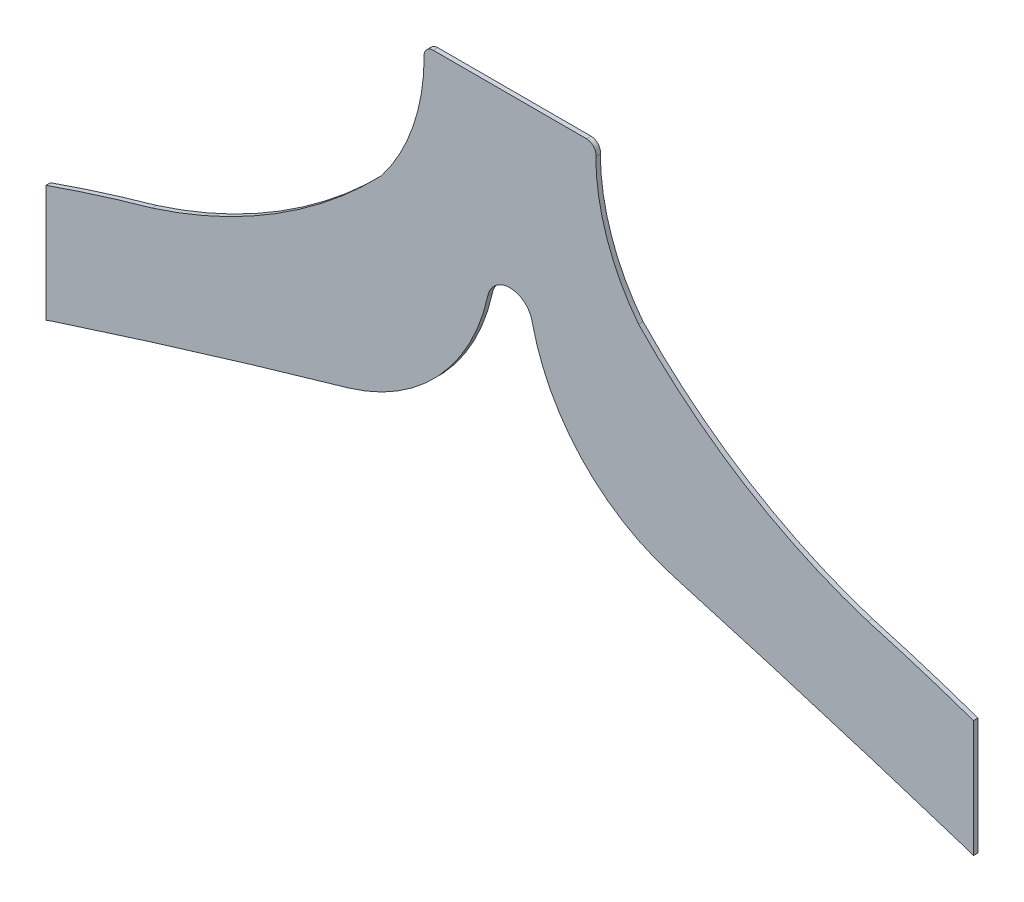
ISO-10303-21;
HEADER;
FILE_DESCRIPTION(('STEP AP214'),'2;1');
FILE_NAME('part.step','',(''),(''),'','','');
FILE_SCHEMA(('AUTOMOTIVE_DESIGN { 1 0 10303 214 1 1 1 1 }'));
ENDSEC;
DATA;
#1=APPLICATION_CONTEXT('core data for automotive mechanical design processes');
#2=APPLICATION_PROTOCOL_DEFINITION('international standard','automotive_design',2000,#1);
#3=PRODUCT_CONTEXT('',#1,'mechanical');
#4=PRODUCT('Part','Part','',(#3));
#5=PRODUCT_RELATED_PRODUCT_CATEGORY('part','',(#4));
#6=PRODUCT_DEFINITION_FORMATION('','',#4);
#7=PRODUCT_DEFINITION_CONTEXT('part definition',#1,'design');
#8=PRODUCT_DEFINITION('design','',#6,#7);
#9=PRODUCT_DEFINITION_SHAPE('','',#8);
#10=(LENGTH_UNIT() NAMED_UNIT(*) SI_UNIT(.MILLI.,.METRE.));
#11=(NAMED_UNIT(*) PLANE_ANGLE_UNIT() SI_UNIT($,.RADIAN.));
#12=(NAMED_UNIT(*) SI_UNIT($,.STERADIAN.) SOLID_ANGLE_UNIT());
#13=UNCERTAINTY_MEASURE_WITH_UNIT(LENGTH_MEASURE(1.E-05),#10,'distance_accuracy_value','');
#14=(GEOMETRIC_REPRESENTATION_CONTEXT(3) GLOBAL_UNCERTAINTY_ASSIGNED_CONTEXT((#13)) GLOBAL_UNIT_ASSIGNED_CONTEXT((#10,
#11,#12)) REPRESENTATION_CONTEXT('',''));
#15=CARTESIAN_POINT('',(0.,0.,0.));
#16=DIRECTION('',(0.,0.,1.));
#17=DIRECTION('',(1.,0.,0.));
#18=AXIS2_PLACEMENT_3D('',#15,#16,#17);
#19=CARTESIAN_POINT('',(-650.809500657787,926.892746035444,0.));
#20=DIRECTION('',(-1.,0.,0.));
#21=DIRECTION('',(0.,-1.,0.));
#22=AXIS2_PLACEMENT_3D('',#19,#20,#21);
#23=PLANE('',#22);
#24=DIRECTION('',(0.,0.,-1.));
#25=VECTOR('',#24,1.);
#26=CARTESIAN_POINT('',(-650.809500657786,687.87310873165,6.35));
#27=LINE('',#26,#25);
#28=CARTESIAN_POINT('',(-650.809500657786,687.87310873165,6.35));
#29=VERTEX_POINT('',#28);
#30=CARTESIAN_POINT('',(-650.809500657786,687.87310873165,0.));
#31=VERTEX_POINT('',#30);
#32=EDGE_CURVE('E44',#29,#31,#27,.T.);
#33=ORIENTED_EDGE('',*,*,#32,.F.);
#34=DIRECTION('',(0.,-1.,0.));
#35=VECTOR('',#34,1.);
#36=CARTESIAN_POINT('',(-650.809500657786,-2255.82427941432,6.35));
#37=LINE('',#36,#35);
#38=CARTESIAN_POINT('',(-650.809500657787,851.947732984082,6.35));
#39=VERTEX_POINT('',#38);
#40=EDGE_CURVE('E305',#39,#29,#37,.T.);
#41=ORIENTED_EDGE('',*,*,#40,.F.);
#42=DIRECTION('',(0.,0.,-1.));
#43=VECTOR('',#42,1.);
#44=CARTESIAN_POINT('',(-650.809500657787,851.947732984082,6.35));
#45=LINE('',#44,#43);
#46=CARTESIAN_POINT('',(-650.809500657787,851.947732984082,0.));
#47=VERTEX_POINT('',#46);
#48=EDGE_CURVE('E302',#39,#47,#45,.T.);
#49=ORIENTED_EDGE('',*,*,#48,.T.);
#50=DIRECTION('',(0.,-1.,0.));
#51=VECTOR('',#50,1.);
#52=CARTESIAN_POINT('',(-650.809500657786,-2255.82427941432,0.));
#53=LINE('',#52,#51);
#54=EDGE_CURVE('E49',#47,#31,#53,.T.);
#55=ORIENTED_EDGE('',*,*,#54,.T.);
#56=EDGE_LOOP('',(#33,#41,#49,#55));
#57=FACE_BOUND('',#56,.T.);
#58=ADVANCED_FACE('F40',(#57),#23,.T.);
#59=CARTESIAN_POINT('',(650.809500657787,926.892746035444,0.));
#60=DIRECTION('',(1.,0.,0.));
#61=DIRECTION('',(0.,-1.,0.));
#62=AXIS2_PLACEMENT_3D('',#59,#60,#61);
#63=PLANE('',#62);
#64=DIRECTION('',(0.,0.,-1.));
#65=VECTOR('',#64,1.);
#66=CARTESIAN_POINT('',(650.809500657786,688.128874906157,6.35));
#67=LINE('',#66,#65);
#68=CARTESIAN_POINT('',(650.809500657786,688.128874906157,0.));
#69=VERTEX_POINT('',#68);
#70=CARTESIAN_POINT('',(650.809500657786,688.128874906157,6.35));
#71=VERTEX_POINT('',#70);
#72=EDGE_CURVE('E308',#69,#71,#67,.F.);
#73=ORIENTED_EDGE('',*,*,#72,.F.);
#74=DIRECTION('',(0.,1.,0.));
#75=VECTOR('',#74,1.);
#76=CARTESIAN_POINT('',(650.809500657786,-2255.82427941432,0.));
#77=LINE('',#76,#75);
#78=CARTESIAN_POINT('',(650.809500657787,852.172496678358,0.));
#79=VERTEX_POINT('',#78);
#80=EDGE_CURVE('E11',#69,#79,#77,.T.);
#81=ORIENTED_EDGE('',*,*,#80,.T.);
#82=DIRECTION('',(0.,0.,-1.));
#83=VECTOR('',#82,1.);
#84=CARTESIAN_POINT('',(650.809500657787,852.172496678358,6.35));
#85=LINE('',#84,#83);
#86=CARTESIAN_POINT('',(650.809500657787,852.172496678358,6.35));
#87=VERTEX_POINT('',#86);
#88=EDGE_CURVE('E309',#79,#87,#85,.F.);
#89=ORIENTED_EDGE('',*,*,#88,.T.);
#90=DIRECTION('',(0.,1.,0.));
#91=VECTOR('',#90,1.);
#92=CARTESIAN_POINT('',(650.809500657786,-2255.82427941432,6.35));
#93=LINE('',#92,#91);
#94=EDGE_CURVE('E180',#71,#87,#93,.T.);
#95=ORIENTED_EDGE('',*,*,#94,.F.);
#96=EDGE_LOOP('',(#73,#81,#89,#95));
#97=FACE_BOUND('',#96,.T.);
#98=ADVANCED_FACE('F42',(#97),#63,.T.);
#99=CARTESIAN_POINT('',(-498.992218517487,308.277459283282,6.35));
#100=DIRECTION('',(0.,0.,-1.));
#101=DIRECTION('',(-1.,0.,0.));
#102=AXIS2_PLACEMENT_3D('',#99,#100,#101);
#103=CYLINDRICAL_SURFACE('',#102,408.829236034553);
#104=CARTESIAN_POINT('',(-498.992218517487,308.277459283282,6.35));
#105=DIRECTION('',(0.,0.,1.));
#106=DIRECTION('',(1.,0.,0.));
#107=AXIS2_PLACEMENT_3D('',#104,#105,#106);
#108=CIRCLE('',#107,408.829236034553);
#109=CARTESIAN_POINT('',(-643.777799858192,690.610402766354,6.35));
#110=VERTEX_POINT('',#109);
#111=EDGE_CURVE('E216',#110,#29,#108,.T.);
#112=ORIENTED_EDGE('',*,*,#111,.T.);
#113=ORIENTED_EDGE('',*,*,#32,.T.);
#114=CARTESIAN_POINT('',(-498.992218517487,308.277459283282,0.));
#115=DIRECTION('',(0.,0.,1.));
#116=DIRECTION('',(1.,0.,0.));
#117=AXIS2_PLACEMENT_3D('',#114,#115,#116);
#118=CIRCLE('',#117,408.829236034553);
#119=CARTESIAN_POINT('',(-643.777799858192,690.610402766354,0.));
#120=VERTEX_POINT('',#119);
#121=EDGE_CURVE('E255',#120,#31,#118,.T.);
#122=ORIENTED_EDGE('',*,*,#121,.F.);
#123=DIRECTION('',(0.,0.,-1.));
#124=VECTOR('',#123,1.);
#125=CARTESIAN_POINT('',(-643.777799858192,690.610402766354,6.35));
#126=LINE('',#125,#124);
#127=EDGE_CURVE('E283',#110,#120,#126,.T.);
#128=ORIENTED_EDGE('',*,*,#127,.F.);
#129=EDGE_LOOP('',(#112,#113,#122,#128));
#130=FACE_BOUND('',#129,.T.);
#131=ADVANCED_FACE('F323',(#130),#103,.F.);
#132=CARTESIAN_POINT('',(3128.37589259121,-10927.1670204163,6.35));
#133=DIRECTION('',(0.,0.,-1.));
#134=DIRECTION('',(-1.,0.,0.));
#135=AXIS2_PLACEMENT_3D('',#132,#133,#134);
#136=CYLINDRICAL_SURFACE('',#135,12214.8227876655);
#137=CARTESIAN_POINT('',(3128.37589259121,-10927.1670204163,0.));
#138=DIRECTION('',(0.,0.,1.));
#139=DIRECTION('',(1.,0.,0.));
#140=AXIS2_PLACEMENT_3D('',#137,#138,#139);
#141=CIRCLE('',#140,12214.8227876655);
#142=CARTESIAN_POINT('',(-226.062921215979,818.029273324219,0.));
#143=VERTEX_POINT('',#142);
#144=EDGE_CURVE('E257',#143,#120,#141,.T.);
#145=ORIENTED_EDGE('',*,*,#144,.F.);
#146=DIRECTION('',(0.,0.,-1.));
#147=VECTOR('',#146,1.);
#148=CARTESIAN_POINT('',(-226.062921215979,818.029273324219,6.35));
#149=LINE('',#148,#147);
#150=CARTESIAN_POINT('',(-226.062921215979,818.029273324219,6.35));
#151=VERTEX_POINT('',#150);
#152=EDGE_CURVE('E281',#151,#143,#149,.T.);
#153=ORIENTED_EDGE('',*,*,#152,.F.);
#154=CARTESIAN_POINT('',(3128.37589259121,-10927.1670204163,6.35));
#155=DIRECTION('',(0.,0.,1.));
#156=DIRECTION('',(1.,0.,0.));
#157=AXIS2_PLACEMENT_3D('',#154,#155,#156);
#158=CIRCLE('',#157,12214.8227876655);
#159=EDGE_CURVE('E219',#151,#110,#158,.T.);
#160=ORIENTED_EDGE('',*,*,#159,.T.);
#161=ORIENTED_EDGE('',*,*,#127,.T.);
#162=EDGE_LOOP('',(#145,#153,#160,#161));
#163=FACE_BOUND('',#162,.T.);
#164=ADVANCED_FACE('F327',(#163),#136,.F.);
#165=CARTESIAN_POINT('',(-305.562292003533,1087.88157833844,6.35));
#166=DIRECTION('',(0.,0.,-1.));
#167=DIRECTION('',(-1.,0.,0.));
#168=AXIS2_PLACEMENT_3D('',#165,#166,#167);
#169=CYLINDRICAL_SURFACE('',#168,281.319065257057);
#170=CARTESIAN_POINT('',(-305.562292003533,1087.88157833844,0.));
#171=DIRECTION('',(0.,0.,1.));
#172=DIRECTION('',(1.,0.,0.));
#173=AXIS2_PLACEMENT_3D('',#170,#171,#172);
#174=CIRCLE('',#173,281.319065257057);
#175=CARTESIAN_POINT('',(-30.8315554757995,1027.35522966256,0.));
#176=VERTEX_POINT('',#175);
#177=EDGE_CURVE('E260',#143,#176,#174,.T.);
#178=ORIENTED_EDGE('',*,*,#177,.T.);
#179=DIRECTION('',(0.,0.,-1.));
#180=VECTOR('',#179,1.);
#181=CARTESIAN_POINT('',(-30.8315554757995,1027.35522966256,6.35));
#182=LINE('',#181,#180);
#183=CARTESIAN_POINT('',(-30.8315554757995,1027.35522966256,6.35));
#184=VERTEX_POINT('',#183);
#185=EDGE_CURVE('E279',#184,#176,#182,.T.);
#186=ORIENTED_EDGE('',*,*,#185,.F.);
#187=CARTESIAN_POINT('',(-305.562292003533,1087.88157833844,6.35));
#188=DIRECTION('',(0.,0.,1.));
#189=DIRECTION('',(1.,0.,0.));
#190=AXIS2_PLACEMENT_3D('',#187,#188,#189);
#191=CIRCLE('',#190,281.319065257057);
#192=EDGE_CURVE('E222',#151,#184,#191,.T.);
#193=ORIENTED_EDGE('',*,*,#192,.F.);
#194=ORIENTED_EDGE('',*,*,#152,.T.);
#195=EDGE_LOOP('',(#178,#186,#193,#194));
#196=FACE_BOUND('',#195,.T.);
#197=ADVANCED_FACE('F331',(#196),#169,.T.);
#198=CARTESIAN_POINT('',(0.320536374879055,1021.222557052,6.35));
#199=DIRECTION('',(0.,0.,-1.));
#200=DIRECTION('',(-1.,0.,0.));
#201=AXIS2_PLACEMENT_3D('',#198,#199,#200);
#202=CYLINDRICAL_SURFACE('',#201,31.7500000002901);
#203=CARTESIAN_POINT('',(0.320536374879055,1021.222557052,0.));
#204=DIRECTION('',(0.,0.,1.));
#205=DIRECTION('',(1.,0.,0.));
#206=AXIS2_PLACEMENT_3D('',#203,#204,#205);
#207=CIRCLE('',#206,31.7500000002901);
#208=CARTESIAN_POINT('',(31.4726282253858,1027.35522966267,0.));
#209=VERTEX_POINT('',#208);
#210=EDGE_CURVE('E263',#209,#176,#207,.T.);
#211=ORIENTED_EDGE('',*,*,#210,.F.);
#212=DIRECTION('',(0.,0.,-1.));
#213=VECTOR('',#212,1.);
#214=CARTESIAN_POINT('',(31.4726282253858,1027.35522966267,6.35));
#215=LINE('',#214,#213);
#216=CARTESIAN_POINT('',(31.4726282253858,1027.35522966267,6.35));
#217=VERTEX_POINT('',#216);
#218=EDGE_CURVE('E277',#217,#209,#215,.T.);
#219=ORIENTED_EDGE('',*,*,#218,.F.);
#220=CARTESIAN_POINT('',(0.320536374879055,1021.222557052,6.35));
#221=DIRECTION('',(0.,0.,1.));
#222=DIRECTION('',(1.,0.,0.));
#223=AXIS2_PLACEMENT_3D('',#220,#221,#222);
#224=CIRCLE('',#223,31.7500000002901);
#225=EDGE_CURVE('E224',#217,#184,#224,.T.);
#226=ORIENTED_EDGE('',*,*,#225,.T.);
#227=ORIENTED_EDGE('',*,*,#185,.T.);
#228=EDGE_LOOP('',(#211,#219,#226,#227));
#229=FACE_BOUND('',#228,.T.);
#230=ADVANCED_FACE('F338',(#229),#202,.F.);
#231=CARTESIAN_POINT('',(306.203364753173,1087.88157833831,6.35));
#232=DIRECTION('',(0.,0.,-1.));
#233=DIRECTION('',(-1.,0.,0.));
#234=AXIS2_PLACEMENT_3D('',#231,#232,#233);
#235=CYLINDRICAL_SURFACE('',#234,281.319065257058);
#236=CARTESIAN_POINT('',(306.203364753173,1087.88157833831,0.));
#237=DIRECTION('',(0.,0.,1.));
#238=DIRECTION('',(1.,0.,0.));
#239=AXIS2_PLACEMENT_3D('',#236,#237,#238);
#240=CIRCLE('',#239,281.319065257058);
#241=CARTESIAN_POINT('',(226.703993965614,818.029273324012,0.));
#242=VERTEX_POINT('',#241);
#243=EDGE_CURVE('E266',#209,#242,#240,.T.);
#244=ORIENTED_EDGE('',*,*,#243,.T.);
#245=DIRECTION('',(0.,0.,-1.));
#246=VECTOR('',#245,1.);
#247=CARTESIAN_POINT('',(226.703993965614,818.029273324012,6.35));
#248=LINE('',#247,#246);
#249=CARTESIAN_POINT('',(226.703993965614,818.029273324012,6.35));
#250=VERTEX_POINT('',#249);
#251=EDGE_CURVE('E275',#250,#242,#248,.T.);
#252=ORIENTED_EDGE('',*,*,#251,.F.);
#253=CARTESIAN_POINT('',(306.203364753173,1087.88157833831,6.35));
#254=DIRECTION('',(0.,0.,1.));
#255=DIRECTION('',(1.,0.,0.));
#256=AXIS2_PLACEMENT_3D('',#253,#254,#255);
#257=CIRCLE('',#256,281.319065257058);
#258=EDGE_CURVE('E227',#217,#250,#257,.T.);
#259=ORIENTED_EDGE('',*,*,#258,.F.);
#260=ORIENTED_EDGE('',*,*,#218,.T.);
#261=EDGE_LOOP('',(#244,#252,#259,#260));
#262=FACE_BOUND('',#261,.T.);
#263=ADVANCED_FACE('F341',(#262),#235,.T.);
#264=CARTESIAN_POINT('',(-3127.73481984159,-10927.1670204165,6.35));
#265=DIRECTION('',(0.,0.,-1.));
#266=DIRECTION('',(-1.,0.,0.));
#267=AXIS2_PLACEMENT_3D('',#264,#265,#266);
#268=CYLINDRICAL_SURFACE('',#267,12214.8227876655);
#269=CARTESIAN_POINT('',(-3127.73481984159,-10927.1670204165,0.));
#270=DIRECTION('',(0.,0.,1.));
#271=DIRECTION('',(1.,0.,0.));
#272=AXIS2_PLACEMENT_3D('',#269,#270,#271);
#273=CIRCLE('',#272,12214.8227876655);
#274=CARTESIAN_POINT('',(644.418872607809,690.610402766146,0.));
#275=VERTEX_POINT('',#274);
#276=EDGE_CURVE('E269',#275,#242,#273,.T.);
#277=ORIENTED_EDGE('',*,*,#276,.F.);
#278=DIRECTION('',(0.,0.,-1.));
#279=VECTOR('',#278,1.);
#280=CARTESIAN_POINT('',(644.418872607809,690.610402766146,6.35));
#281=LINE('',#280,#279);
#282=CARTESIAN_POINT('',(644.418872607809,690.610402766146,6.35));
#283=VERTEX_POINT('',#282);
#284=EDGE_CURVE('E190',#283,#275,#281,.T.);
#285=ORIENTED_EDGE('',*,*,#284,.F.);
#286=CARTESIAN_POINT('',(-3127.73481984159,-10927.1670204165,6.35));
#287=DIRECTION('',(0.,0.,1.));
#288=DIRECTION('',(1.,0.,0.));
#289=AXIS2_PLACEMENT_3D('',#286,#287,#288);
#290=CIRCLE('',#289,12214.8227876655);
#291=EDGE_CURVE('E229',#283,#250,#290,.T.);
#292=ORIENTED_EDGE('',*,*,#291,.T.);
#293=ORIENTED_EDGE('',*,*,#251,.T.);
#294=EDGE_LOOP('',(#277,#285,#292,#293));
#295=FACE_BOUND('',#294,.T.);
#296=ADVANCED_FACE('F345',(#295),#268,.F.);
#297=CARTESIAN_POINT('',(499.633291267108,308.277459283071,6.35));
#298=DIRECTION('',(0.,0.,-1.));
#299=DIRECTION('',(-1.,0.,0.));
#300=AXIS2_PLACEMENT_3D('',#297,#298,#299);
#301=CYLINDRICAL_SURFACE('',#300,408.829236034554);
#302=CARTESIAN_POINT('',(499.633291267108,308.277459283071,0.));
#303=DIRECTION('',(0.,0.,1.));
#304=DIRECTION('',(1.,0.,0.));
#305=AXIS2_PLACEMENT_3D('',#302,#303,#304);
#306=CIRCLE('',#305,408.829236034554);
#307=EDGE_CURVE('E183',#69,#275,#306,.T.);
#308=ORIENTED_EDGE('',*,*,#307,.F.);
#309=ORIENTED_EDGE('',*,*,#72,.T.);
#310=CARTESIAN_POINT('',(499.633291267108,308.277459283071,6.35));
#311=DIRECTION('',(0.,0.,1.));
#312=DIRECTION('',(1.,0.,0.));
#313=AXIS2_PLACEMENT_3D('',#310,#311,#312);
#314=CIRCLE('',#313,408.829236034554);
#315=EDGE_CURVE('E232',#71,#283,#314,.T.);
#316=ORIENTED_EDGE('',*,*,#315,.T.);
#317=ORIENTED_EDGE('',*,*,#284,.T.);
#318=EDGE_LOOP('',(#308,#309,#316,#317));
#319=FACE_BOUND('',#318,.T.);
#320=ADVANCED_FACE('F347',(#319),#301,.F.);
#321=CARTESIAN_POINT('',(-142.666058779058,-1412.01124446139,6.35));
#322=DIRECTION('',(0.,0.,-1.));
#323=DIRECTION('',(-1.,0.,0.));
#324=AXIS2_PLACEMENT_3D('',#321,#322,#323);
#325=CYLINDRICAL_SURFACE('',#324,2399.193922355);
#326=ORIENTED_EDGE('',*,*,#88,.F.);
#327=CARTESIAN_POINT('',(-142.666058779058,-1412.01124446139,0.));
#328=DIRECTION('',(0.,0.,1.));
#329=DIRECTION('',(1.,0.,0.));
#330=AXIS2_PLACEMENT_3D('',#327,#328,#329);
#331=CIRCLE('',#330,2399.193922355);
#332=CARTESIAN_POINT('',(502.700344781083,898.753495234334,0.));
#333=VERTEX_POINT('',#332);
#334=EDGE_CURVE('E65',#79,#333,#331,.T.);
#335=ORIENTED_EDGE('',*,*,#334,.T.);
#336=DIRECTION('',(0.,0.,-1.));
#337=VECTOR('',#336,1.);
#338=CARTESIAN_POINT('',(502.700344781083,898.753495234334,6.35));
#339=LINE('',#338,#337);
#340=CARTESIAN_POINT('',(502.700344781083,898.753495234334,6.35));
#341=VERTEX_POINT('',#340);
#342=EDGE_CURVE('E186',#341,#333,#339,.T.);
#343=ORIENTED_EDGE('',*,*,#342,.F.);
#344=CARTESIAN_POINT('',(-142.666058779058,-1412.01124446139,6.35));
#345=DIRECTION('',(0.,0.,1.));
#346=DIRECTION('',(1.,0.,0.));
#347=AXIS2_PLACEMENT_3D('',#344,#345,#346);
#348=CIRCLE('',#347,2399.193922355);
#349=EDGE_CURVE('E171',#87,#341,#348,.T.);
#350=ORIENTED_EDGE('',*,*,#349,.F.);
#351=EDGE_LOOP('',(#326,#335,#343,#350));
#352=FACE_BOUND('',#351,.T.);
#353=ADVANCED_FACE('F187',(#352),#325,.T.);
#354=CARTESIAN_POINT('',(734.983017466509,1631.24728419533,6.35));
#355=DIRECTION('',(0.,0.,-1.));
#356=DIRECTION('',(-1.,0.,0.));
#357=AXIS2_PLACEMENT_3D('',#354,#355,#356);
#358=CYLINDRICAL_SURFACE('',#357,768.441533817843);
#359=CARTESIAN_POINT('',(734.983017466509,1631.24728419533,0.));
#360=DIRECTION('',(0.,0.,1.));
#361=DIRECTION('',(1.,0.,0.));
#362=AXIS2_PLACEMENT_3D('',#359,#360,#361);
#363=CIRCLE('',#362,768.441533817843);
#364=CARTESIAN_POINT('',(180.802723378544,1098.90661080948,0.));
#365=VERTEX_POINT('',#364);
#366=EDGE_CURVE('E236',#365,#333,#363,.T.);
#367=ORIENTED_EDGE('',*,*,#366,.F.);
#368=DIRECTION('',(0.,0.,-1.));
#369=VECTOR('',#368,1.);
#370=CARTESIAN_POINT('',(180.802723378544,1098.90661080948,6.35));
#371=LINE('',#370,#369);
#372=CARTESIAN_POINT('',(180.802723378544,1098.90661080948,6.35));
#373=VERTEX_POINT('',#372);
#374=EDGE_CURVE('E191',#373,#365,#371,.T.);
#375=ORIENTED_EDGE('',*,*,#374,.F.);
#376=CARTESIAN_POINT('',(734.983017466509,1631.24728419533,6.35));
#377=DIRECTION('',(0.,0.,1.));
#378=DIRECTION('',(1.,0.,0.));
#379=AXIS2_PLACEMENT_3D('',#376,#377,#378);
#380=CIRCLE('',#379,768.441533817843);
#381=EDGE_CURVE('E177',#373,#341,#380,.T.);
#382=ORIENTED_EDGE('',*,*,#381,.T.);
#383=ORIENTED_EDGE('',*,*,#342,.T.);
#384=EDGE_LOOP('',(#367,#375,#382,#383));
#385=FACE_BOUND('',#384,.T.);
#386=ADVANCED_FACE('F193',(#385),#358,.F.);
#387=CARTESIAN_POINT('',(406.958145468166,1274.3659015756,6.35));
#388=DIRECTION('',(0.,0.,-1.));
#389=DIRECTION('',(-1.,0.,0.));
#390=AXIS2_PLACEMENT_3D('',#387,#388,#389);
#391=CYLINDRICAL_SURFACE('',#390,286.238078628063);
#392=CARTESIAN_POINT('',(406.958145468166,1274.3659015756,0.));
#393=DIRECTION('',(0.,0.,1.));
#394=DIRECTION('',(1.,0.,0.));
#395=AXIS2_PLACEMENT_3D('',#392,#393,#394);
#396=CIRCLE('',#395,286.238078628063);
#397=CARTESIAN_POINT('',(120.726859821317,1272.39390420271,0.));
#398=VERTEX_POINT('',#397);
#399=EDGE_CURVE('E238',#398,#365,#396,.T.);
#400=ORIENTED_EDGE('',*,*,#399,.F.);
#401=DIRECTION('',(0.,0.,-1.));
#402=VECTOR('',#401,1.);
#403=CARTESIAN_POINT('',(120.726859821317,1272.39390420271,6.35));
#404=LINE('',#403,#402);
#405=CARTESIAN_POINT('',(120.726859821317,1272.39390420271,6.35));
#406=VERTEX_POINT('',#405);
#407=EDGE_CURVE('E296',#406,#398,#404,.T.);
#408=ORIENTED_EDGE('',*,*,#407,.F.);
#409=CARTESIAN_POINT('',(406.958145468166,1274.3659015756,6.35));
#410=DIRECTION('',(0.,0.,1.));
#411=DIRECTION('',(1.,0.,0.));
#412=AXIS2_PLACEMENT_3D('',#409,#410,#411);
#413=CIRCLE('',#412,286.238078628063);
#414=EDGE_CURVE('E195',#406,#373,#413,.T.);
#415=ORIENTED_EDGE('',*,*,#414,.T.);
#416=ORIENTED_EDGE('',*,*,#374,.T.);
#417=EDGE_LOOP('',(#400,#408,#415,#416));
#418=FACE_BOUND('',#417,.T.);
#419=ADVANCED_FACE('F400',(#418),#391,.F.);
#420=CARTESIAN_POINT('',(107.914779346256,1274.79894622315,6.35));
#421=DIRECTION('',(0.,0.,-1.));
#422=DIRECTION('',(-1.,0.,0.));
#423=AXIS2_PLACEMENT_3D('',#420,#421,#422);
#424=CYLINDRICAL_SURFACE('',#423,13.0358595121113);
#425=CARTESIAN_POINT('',(107.914779346256,1274.79894622315,0.));
#426=DIRECTION('',(0.,0.,1.));
#427=DIRECTION('',(1.,0.,0.));
#428=AXIS2_PLACEMENT_3D('',#425,#426,#427);
#429=CIRCLE('',#428,13.0358595121113);
#430=CARTESIAN_POINT('',(107.914779346257,1287.83480573526,0.));
#431=VERTEX_POINT('',#430);
#432=EDGE_CURVE('E241',#398,#431,#429,.T.);
#433=ORIENTED_EDGE('',*,*,#432,.T.);
#434=DIRECTION('',(0.,0.,-1.));
#435=VECTOR('',#434,1.);
#436=CARTESIAN_POINT('',(107.914779346257,1287.83480573526,6.35));
#437=LINE('',#436,#435);
#438=CARTESIAN_POINT('',(107.914779346257,1287.83480573526,6.35));
#439=VERTEX_POINT('',#438);
#440=EDGE_CURVE('E293',#439,#431,#437,.T.);
#441=ORIENTED_EDGE('',*,*,#440,.F.);
#442=CARTESIAN_POINT('',(107.914779346256,1274.79894622315,6.35));
#443=DIRECTION('',(0.,0.,1.));
#444=DIRECTION('',(1.,0.,0.));
#445=AXIS2_PLACEMENT_3D('',#442,#443,#444);
#446=CIRCLE('',#445,13.0358595121113);
#447=EDGE_CURVE('E200',#406,#439,#446,.T.);
#448=ORIENTED_EDGE('',*,*,#447,.F.);
#449=ORIENTED_EDGE('',*,*,#407,.T.);
#450=EDGE_LOOP('',(#433,#441,#448,#449));
#451=FACE_BOUND('',#450,.T.);
#452=ADVANCED_FACE('F396',(#451),#424,.T.);
#453=CARTESIAN_POINT('',(203.810506836863,1287.83480573526,6.35));
#454=DIRECTION('',(0.,-1.,0.));
#455=DIRECTION('',(0.,0.,-1.));
#456=AXIS2_PLACEMENT_3D('',#453,#454,#455);
#457=PLANE('',#456);
#458=DIRECTION('',(-1.,0.,0.));
#459=VECTOR('',#458,1.);
#460=CARTESIAN_POINT('',(203.810506836863,1287.83480573526,0.));
#461=LINE('',#460,#459);
#462=CARTESIAN_POINT('',(-107.273706600276,1287.83480573526,0.));
#463=VERTEX_POINT('',#462);
#464=EDGE_CURVE('E243',#431,#463,#461,.T.);
#465=ORIENTED_EDGE('',*,*,#464,.T.);
#466=DIRECTION('',(0.,0.,-1.));
#467=VECTOR('',#466,1.);
#468=CARTESIAN_POINT('',(-107.273706600276,1287.83480573526,6.35));
#469=LINE('',#468,#467);
#470=CARTESIAN_POINT('',(-107.273706600276,1287.83480573526,6.35));
#471=VERTEX_POINT('',#470);
#472=EDGE_CURVE('E290',#471,#463,#469,.T.);
#473=ORIENTED_EDGE('',*,*,#472,.F.);
#474=DIRECTION('',(-1.,0.,0.));
#475=VECTOR('',#474,1.);
#476=CARTESIAN_POINT('',(203.810506836863,1287.83480573526,6.35));
#477=LINE('',#476,#475);
#478=EDGE_CURVE('E204',#439,#471,#477,.T.);
#479=ORIENTED_EDGE('',*,*,#478,.F.);
#480=ORIENTED_EDGE('',*,*,#440,.T.);
#481=EDGE_LOOP('',(#465,#473,#479,#480));
#482=FACE_BOUND('',#481,.T.);
#483=ADVANCED_FACE('F392',(#482),#457,.F.);
#484=CARTESIAN_POINT('',(-107.273706600278,1274.79894622315,6.35));
#485=DIRECTION('',(0.,0.,-1.));
#486=DIRECTION('',(-1.,0.,0.));
#487=AXIS2_PLACEMENT_3D('',#484,#485,#486);
#488=CYLINDRICAL_SURFACE('',#487,13.0358595121113);
#489=CARTESIAN_POINT('',(-107.273706600278,1274.79894622315,0.));
#490=DIRECTION('',(0.,0.,1.));
#491=DIRECTION('',(1.,0.,0.));
#492=AXIS2_PLACEMENT_3D('',#489,#490,#491);
#493=CIRCLE('',#492,13.0358595121113);
#494=CARTESIAN_POINT('',(-120.08578707534,1272.39390420272,0.));
#495=VERTEX_POINT('',#494);
#496=EDGE_CURVE('E245',#463,#495,#493,.T.);
#497=ORIENTED_EDGE('',*,*,#496,.T.);
#498=DIRECTION('',(0.,0.,-1.));
#499=VECTOR('',#498,1.);
#500=CARTESIAN_POINT('',(-120.08578707534,1272.39390420272,6.35));
#501=LINE('',#500,#499);
#502=CARTESIAN_POINT('',(-120.08578707534,1272.39390420272,6.35));
#503=VERTEX_POINT('',#502);
#504=EDGE_CURVE('E288',#503,#495,#501,.T.);
#505=ORIENTED_EDGE('',*,*,#504,.F.);
#506=CARTESIAN_POINT('',(-107.273706600278,1274.79894622315,6.35));
#507=DIRECTION('',(0.,0.,1.));
#508=DIRECTION('',(1.,0.,0.));
#509=AXIS2_PLACEMENT_3D('',#506,#507,#508);
#510=CIRCLE('',#509,13.0358595121113);
#511=EDGE_CURVE('E206',#471,#503,#510,.T.);
#512=ORIENTED_EDGE('',*,*,#511,.F.);
#513=ORIENTED_EDGE('',*,*,#472,.T.);
#514=EDGE_LOOP('',(#497,#505,#512,#513));
#515=FACE_BOUND('',#514,.T.);
#516=ADVANCED_FACE('F388',(#515),#488,.T.);
#517=CARTESIAN_POINT('',(-406.317072722186,1274.3659015756,6.35));
#518=DIRECTION('',(0.,0.,-1.));
#519=DIRECTION('',(-1.,0.,0.));
#520=AXIS2_PLACEMENT_3D('',#517,#518,#519);
#521=CYLINDRICAL_SURFACE('',#520,286.238078628062);
#522=CARTESIAN_POINT('',(-406.317072722186,1274.3659015756,0.));
#523=DIRECTION('',(0.,0.,1.));
#524=DIRECTION('',(1.,0.,0.));
#525=AXIS2_PLACEMENT_3D('',#522,#523,#524);
#526=CIRCLE('',#525,286.238078628062);
#527=CARTESIAN_POINT('',(-180.16165063237,1098.90661080973,0.));
#528=VERTEX_POINT('',#527);
#529=EDGE_CURVE('E248',#528,#495,#526,.T.);
#530=ORIENTED_EDGE('',*,*,#529,.F.);
#531=DIRECTION('',(0.,0.,-1.));
#532=VECTOR('',#531,1.);
#533=CARTESIAN_POINT('',(-180.16165063237,1098.90661080973,6.35));
#534=LINE('',#533,#532);
#535=CARTESIAN_POINT('',(-180.16165063237,1098.90661080973,6.35));
#536=VERTEX_POINT('',#535);
#537=EDGE_CURVE('E286',#536,#528,#534,.T.);
#538=ORIENTED_EDGE('',*,*,#537,.F.);
#539=CARTESIAN_POINT('',(-406.317072722186,1274.3659015756,6.35));
#540=DIRECTION('',(0.,0.,1.));
#541=DIRECTION('',(1.,0.,0.));
#542=AXIS2_PLACEMENT_3D('',#539,#540,#541);
#543=CIRCLE('',#542,286.238078628062);
#544=EDGE_CURVE('E208',#536,#503,#543,.T.);
#545=ORIENTED_EDGE('',*,*,#544,.T.);
#546=ORIENTED_EDGE('',*,*,#504,.T.);
#547=EDGE_LOOP('',(#530,#538,#545,#546));
#548=FACE_BOUND('',#547,.T.);
#549=ADVANCED_FACE('F384',(#548),#521,.F.);
#550=CARTESIAN_POINT('',(-734.341944720559,1631.24728419536,6.35));
#551=DIRECTION('',(0.,0.,-1.));
#552=DIRECTION('',(-1.,0.,0.));
#553=AXIS2_PLACEMENT_3D('',#550,#551,#552);
#554=CYLINDRICAL_SURFACE('',#553,768.441533817849);
#555=CARTESIAN_POINT('',(-734.341944720559,1631.24728419536,0.));
#556=DIRECTION('',(0.,0.,1.));
#557=DIRECTION('',(1.,0.,0.));
#558=AXIS2_PLACEMENT_3D('',#555,#556,#557);
#559=CIRCLE('',#558,768.441533817849);
#560=CARTESIAN_POINT('',(-502.059272035128,898.753495234356,0.));
#561=VERTEX_POINT('',#560);
#562=EDGE_CURVE('E251',#561,#528,#559,.T.);
#563=ORIENTED_EDGE('',*,*,#562,.F.);
#564=DIRECTION('',(0.,0.,-1.));
#565=VECTOR('',#564,1.);
#566=CARTESIAN_POINT('',(-502.059272035128,898.753495234356,6.35));
#567=LINE('',#566,#565);
#568=CARTESIAN_POINT('',(-502.059272035128,898.753495234356,6.35));
#569=VERTEX_POINT('',#568);
#570=EDGE_CURVE('E234',#569,#561,#567,.T.);
#571=ORIENTED_EDGE('',*,*,#570,.F.);
#572=CARTESIAN_POINT('',(-734.341944720559,1631.24728419536,6.35));
#573=DIRECTION('',(0.,0.,1.));
#574=DIRECTION('',(1.,0.,0.));
#575=AXIS2_PLACEMENT_3D('',#572,#573,#574);
#576=CIRCLE('',#575,768.441533817849);
#577=EDGE_CURVE('E211',#569,#536,#576,.T.);
#578=ORIENTED_EDGE('',*,*,#577,.T.);
#579=ORIENTED_EDGE('',*,*,#537,.T.);
#580=EDGE_LOOP('',(#563,#571,#578,#579));
#581=FACE_BOUND('',#580,.T.);
#582=ADVANCED_FACE('F381',(#581),#554,.F.);
#583=CARTESIAN_POINT('',(143.307131525011,-1412.01124446136,6.35));
#584=DIRECTION('',(0.,0.,-1.));
#585=DIRECTION('',(-1.,0.,0.));
#586=AXIS2_PLACEMENT_3D('',#583,#584,#585);
#587=CYLINDRICAL_SURFACE('',#586,2399.193922355);
#588=ORIENTED_EDGE('',*,*,#48,.F.);
#589=CARTESIAN_POINT('',(143.307131525011,-1412.01124446136,6.35));
#590=DIRECTION('',(0.,0.,1.));
#591=DIRECTION('',(1.,0.,0.));
#592=AXIS2_PLACEMENT_3D('',#589,#590,#591);
#593=CIRCLE('',#592,2399.193922355);
#594=EDGE_CURVE('E214',#569,#39,#593,.T.);
#595=ORIENTED_EDGE('',*,*,#594,.F.);
#596=ORIENTED_EDGE('',*,*,#570,.T.);
#597=CARTESIAN_POINT('',(143.307131525011,-1412.01124446136,0.));
#598=DIRECTION('',(0.,0.,1.));
#599=DIRECTION('',(1.,0.,0.));
#600=AXIS2_PLACEMENT_3D('',#597,#598,#599);
#601=CIRCLE('',#600,2399.193922355);
#602=EDGE_CURVE('E57',#561,#47,#601,.T.);
#603=ORIENTED_EDGE('',*,*,#602,.T.);
#604=EDGE_LOOP('',(#588,#595,#596,#603));
#605=FACE_BOUND('',#604,.T.);
#606=ADVANCED_FACE('F364',(#605),#587,.T.);
#607=CARTESIAN_POINT('',(203.810506836863,-2255.82427941432,0.));
#608=DIRECTION('',(0.,0.,1.));
#609=DIRECTION('',(1.,0.,0.));
#610=AXIS2_PLACEMENT_3D('',#607,#608,#609);
#611=PLANE('',#610);
#612=ORIENTED_EDGE('',*,*,#54,.F.);
#613=ORIENTED_EDGE('',*,*,#602,.F.);
#614=ORIENTED_EDGE('',*,*,#562,.T.);
#615=ORIENTED_EDGE('',*,*,#529,.T.);
#616=ORIENTED_EDGE('',*,*,#496,.F.);
#617=ORIENTED_EDGE('',*,*,#464,.F.);
#618=ORIENTED_EDGE('',*,*,#432,.F.);
#619=ORIENTED_EDGE('',*,*,#399,.T.);
#620=ORIENTED_EDGE('',*,*,#366,.T.);
#621=ORIENTED_EDGE('',*,*,#334,.F.);
#622=ORIENTED_EDGE('',*,*,#80,.F.);
#623=ORIENTED_EDGE('',*,*,#307,.T.);
#624=ORIENTED_EDGE('',*,*,#276,.T.);
#625=ORIENTED_EDGE('',*,*,#243,.F.);
#626=ORIENTED_EDGE('',*,*,#210,.T.);
#627=ORIENTED_EDGE('',*,*,#177,.F.);
#628=ORIENTED_EDGE('',*,*,#144,.T.);
#629=ORIENTED_EDGE('',*,*,#121,.T.);
#630=EDGE_LOOP('',(#612,#613,#614,#615,#616,#617,#618,#619,#620,#621,#622,#623,#624,#625,#626,
#627,#628,#629));
#631=FACE_BOUND('',#630,.T.);
#632=ADVANCED_FACE('F316',(#631),#611,.F.);
#633=CARTESIAN_POINT('',(203.810506836863,-2255.82427941432,6.35));
#634=DIRECTION('',(0.,0.,1.));
#635=DIRECTION('',(1.,0.,0.));
#636=AXIS2_PLACEMENT_3D('',#633,#634,#635);
#637=PLANE('',#636);
#638=ORIENTED_EDGE('',*,*,#594,.T.);
#639=ORIENTED_EDGE('',*,*,#40,.T.);
#640=ORIENTED_EDGE('',*,*,#111,.F.);
#641=ORIENTED_EDGE('',*,*,#159,.F.);
#642=ORIENTED_EDGE('',*,*,#192,.T.);
#643=ORIENTED_EDGE('',*,*,#225,.F.);
#644=ORIENTED_EDGE('',*,*,#258,.T.);
#645=ORIENTED_EDGE('',*,*,#291,.F.);
#646=ORIENTED_EDGE('',*,*,#315,.F.);
#647=ORIENTED_EDGE('',*,*,#94,.T.);
#648=ORIENTED_EDGE('',*,*,#349,.T.);
#649=ORIENTED_EDGE('',*,*,#381,.F.);
#650=ORIENTED_EDGE('',*,*,#414,.F.);
#651=ORIENTED_EDGE('',*,*,#447,.T.);
#652=ORIENTED_EDGE('',*,*,#478,.T.);
#653=ORIENTED_EDGE('',*,*,#511,.T.);
#654=ORIENTED_EDGE('',*,*,#544,.F.);
#655=ORIENTED_EDGE('',*,*,#577,.F.);
#656=EDGE_LOOP('',(#638,#639,#640,#641,#642,#643,#644,#645,#646,#647,#648,#649,#650,#651,#652,
#653,#654,#655));
#657=FACE_BOUND('',#656,.T.);
#658=ADVANCED_FACE('F174',(#657),#637,.T.);
#659=CLOSED_SHELL('',(#58,#98,#131,#164,#197,#230,#263,#296,#320,#353,#386,#419,#452,#483,#516,
#549,#582,#606,#632,#658));
#660=MANIFOLD_SOLID_BREP('B2',#659);
#661=ADVANCED_BREP_SHAPE_REPRESENTATION('',(#18,#660),#14);
#662=SHAPE_DEFINITION_REPRESENTATION(#9,#661);
ENDSEC;
END-ISO-10303-21;
